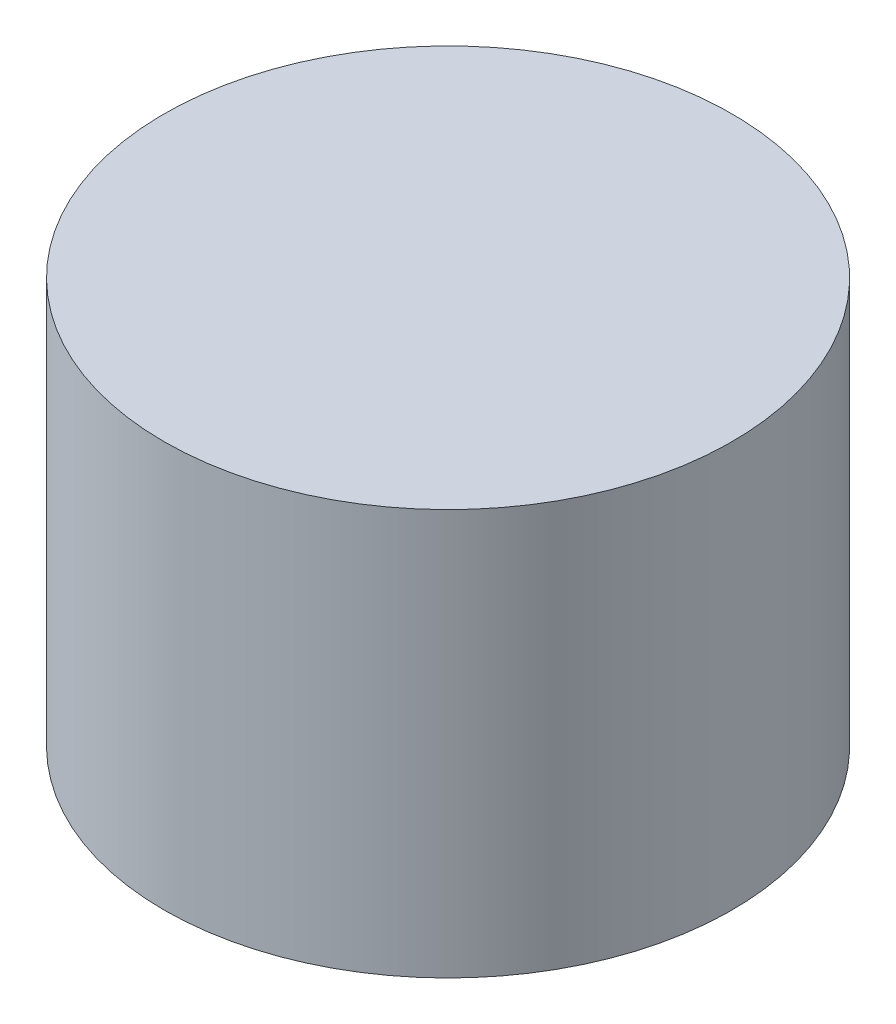
ISO-10303-21;
HEADER;
FILE_DESCRIPTION(('STEP AP214'),'2;1');
FILE_NAME('part.step','',(''),(''),'','','');
FILE_SCHEMA(('AUTOMOTIVE_DESIGN { 1 0 10303 214 1 1 1 1 }'));
ENDSEC;
DATA;
#1=APPLICATION_CONTEXT('core data for automotive mechanical design processes');
#2=APPLICATION_PROTOCOL_DEFINITION('international standard','automotive_design',2000,#1);
#3=PRODUCT_CONTEXT('',#1,'mechanical');
#4=PRODUCT('Part','Part','',(#3));
#5=PRODUCT_RELATED_PRODUCT_CATEGORY('part','',(#4));
#6=PRODUCT_DEFINITION_FORMATION('','',#4);
#7=PRODUCT_DEFINITION_CONTEXT('part definition',#1,'design');
#8=PRODUCT_DEFINITION('design','',#6,#7);
#9=PRODUCT_DEFINITION_SHAPE('','',#8);
#10=(LENGTH_UNIT() NAMED_UNIT(*) SI_UNIT(.MILLI.,.METRE.));
#11=(NAMED_UNIT(*) PLANE_ANGLE_UNIT() SI_UNIT($,.RADIAN.));
#12=(NAMED_UNIT(*) SI_UNIT($,.STERADIAN.) SOLID_ANGLE_UNIT());
#13=UNCERTAINTY_MEASURE_WITH_UNIT(LENGTH_MEASURE(1.E-05),#10,'distance_accuracy_value','');
#14=(GEOMETRIC_REPRESENTATION_CONTEXT(3) GLOBAL_UNCERTAINTY_ASSIGNED_CONTEXT((#13)) GLOBAL_UNIT_ASSIGNED_CONTEXT((#10,
#11,#12)) REPRESENTATION_CONTEXT('',''));
#15=CARTESIAN_POINT('',(0.,0.,0.));
#16=DIRECTION('',(0.,0.,1.));
#17=DIRECTION('',(1.,0.,0.));
#18=AXIS2_PLACEMENT_3D('',#15,#16,#17);
#19=CARTESIAN_POINT('',(0.,5.,0.));
#20=DIRECTION('',(0.,-1.,0.));
#21=DIRECTION('',(0.,0.,-1.));
#22=AXIS2_PLACEMENT_3D('',#19,#20,#21);
#23=CYLINDRICAL_SURFACE('',#22,3.5);
#24=CARTESIAN_POINT('',(0.,5.,0.));
#25=DIRECTION('',(0.,1.,0.));
#26=DIRECTION('',(0.,0.,1.));
#27=AXIS2_PLACEMENT_3D('',#24,#25,#26);
#28=CIRCLE('',#27,3.5);
#29=CARTESIAN_POINT('',(0.,5.,3.5));
#30=VERTEX_POINT('',#29);
#31=EDGE_CURVE('E10',#30,#30,#28,.T.);
#32=ORIENTED_EDGE('',*,*,#31,.F.);
#33=EDGE_LOOP('',(#32));
#34=FACE_BOUND('',#33,.T.);
#35=CARTESIAN_POINT('',(0.,0.,0.));
#36=DIRECTION('',(0.,1.,0.));
#37=DIRECTION('',(0.,0.,1.));
#38=AXIS2_PLACEMENT_3D('',#35,#36,#37);
#39=CIRCLE('',#38,3.5);
#40=CARTESIAN_POINT('',(0.,0.,3.5));
#41=VERTEX_POINT('',#40);
#42=EDGE_CURVE('E33',#41,#41,#39,.T.);
#43=ORIENTED_EDGE('',*,*,#42,.T.);
#44=EDGE_LOOP('',(#43));
#45=FACE_BOUND('',#44,.T.);
#46=ADVANCED_FACE('F30',(#34,#45),#23,.T.);
#47=CARTESIAN_POINT('',(0.,5.,0.));
#48=DIRECTION('',(0.,1.,0.));
#49=DIRECTION('',(0.,0.,1.));
#50=AXIS2_PLACEMENT_3D('',#47,#48,#49);
#51=PLANE('',#50);
#52=ORIENTED_EDGE('',*,*,#31,.T.);
#53=EDGE_LOOP('',(#52));
#54=FACE_BOUND('',#53,.T.);
#55=ADVANCED_FACE('F45',(#54),#51,.T.);
#56=CARTESIAN_POINT('',(0.,0.,0.));
#57=DIRECTION('',(0.,1.,0.));
#58=DIRECTION('',(0.,0.,1.));
#59=AXIS2_PLACEMENT_3D('',#56,#57,#58);
#60=PLANE('',#59);
#61=ORIENTED_EDGE('',*,*,#42,.F.);
#62=EDGE_LOOP('',(#61));
#63=FACE_BOUND('',#62,.T.);
#64=ADVANCED_FACE('F43',(#63),#60,.F.);
#65=CLOSED_SHELL('',(#46,#55,#64));
#66=MANIFOLD_SOLID_BREP('B2',#65);
#67=ADVANCED_BREP_SHAPE_REPRESENTATION('',(#18,#66),#14);
#68=SHAPE_DEFINITION_REPRESENTATION(#9,#67);
ENDSEC;
END-ISO-10303-21;
